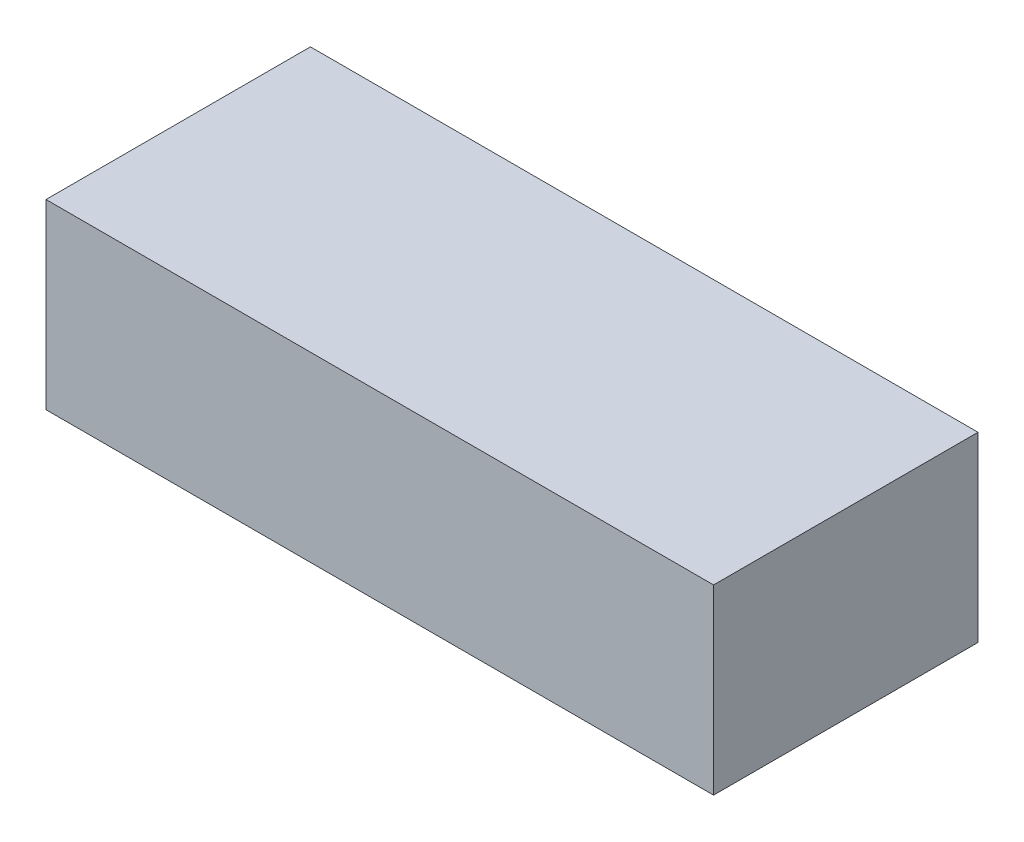
ISO-10303-21;
HEADER;
FILE_DESCRIPTION(('STEP AP214'),'2;1');
FILE_NAME('part.step','',(''),(''),'','','');
FILE_SCHEMA(('AUTOMOTIVE_DESIGN { 1 0 10303 214 1 1 1 1 }'));
ENDSEC;
DATA;
#1=APPLICATION_CONTEXT('core data for automotive mechanical design processes');
#2=APPLICATION_PROTOCOL_DEFINITION('international standard','automotive_design',2000,#1);
#3=PRODUCT_CONTEXT('',#1,'mechanical');
#4=PRODUCT('Part','Part','',(#3));
#5=PRODUCT_RELATED_PRODUCT_CATEGORY('part','',(#4));
#6=PRODUCT_DEFINITION_FORMATION('','',#4);
#7=PRODUCT_DEFINITION_CONTEXT('part definition',#1,'design');
#8=PRODUCT_DEFINITION('design','',#6,#7);
#9=PRODUCT_DEFINITION_SHAPE('','',#8);
#10=(LENGTH_UNIT() NAMED_UNIT(*) SI_UNIT(.MILLI.,.METRE.));
#11=(NAMED_UNIT(*) PLANE_ANGLE_UNIT() SI_UNIT($,.RADIAN.));
#12=(NAMED_UNIT(*) SI_UNIT($,.STERADIAN.) SOLID_ANGLE_UNIT());
#13=UNCERTAINTY_MEASURE_WITH_UNIT(LENGTH_MEASURE(1.E-05),#10,'distance_accuracy_value','');
#14=(GEOMETRIC_REPRESENTATION_CONTEXT(3) GLOBAL_UNCERTAINTY_ASSIGNED_CONTEXT((#13)) GLOBAL_UNIT_ASSIGNED_CONTEXT((#10,
#11,#12)) REPRESENTATION_CONTEXT('',''));
#15=CARTESIAN_POINT('',(0.,0.,0.));
#16=DIRECTION('',(0.,0.,1.));
#17=DIRECTION('',(1.,0.,0.));
#18=AXIS2_PLACEMENT_3D('',#15,#16,#17);
#19=CARTESIAN_POINT('',(38.5,21.,-15.25));
#20=DIRECTION('',(-1.,0.,0.));
#21=DIRECTION('',(0.,0.,1.));
#22=AXIS2_PLACEMENT_3D('',#19,#20,#21);
#23=PLANE('',#22);
#24=DIRECTION('',(0.,0.,-1.));
#25=VECTOR('',#24,1.);
#26=CARTESIAN_POINT('',(38.5,0.,-15.25));
#27=LINE('',#26,#25);
#28=CARTESIAN_POINT('',(38.5,0.,15.25));
#29=VERTEX_POINT('',#28);
#30=CARTESIAN_POINT('',(38.5,0.,-15.25));
#31=VERTEX_POINT('',#30);
#32=EDGE_CURVE('E102',#29,#31,#27,.T.);
#33=ORIENTED_EDGE('',*,*,#32,.T.);
#34=DIRECTION('',(0.,-1.,0.));
#35=VECTOR('',#34,1.);
#36=CARTESIAN_POINT('',(38.5,21.,-15.25));
#37=LINE('',#36,#35);
#38=CARTESIAN_POINT('',(38.5,21.,-15.25));
#39=VERTEX_POINT('',#38);
#40=EDGE_CURVE('E11',#39,#31,#37,.T.);
#41=ORIENTED_EDGE('',*,*,#40,.F.);
#42=DIRECTION('',(0.,0.,-1.));
#43=VECTOR('',#42,1.);
#44=CARTESIAN_POINT('',(38.5,21.,-15.25));
#45=LINE('',#44,#43);
#46=CARTESIAN_POINT('',(38.5,21.,15.25));
#47=VERTEX_POINT('',#46);
#48=EDGE_CURVE('E90',#47,#39,#45,.T.);
#49=ORIENTED_EDGE('',*,*,#48,.F.);
#50=DIRECTION('',(0.,-1.,0.));
#51=VECTOR('',#50,1.);
#52=CARTESIAN_POINT('',(38.5,21.,15.25));
#53=LINE('',#52,#51);
#54=EDGE_CURVE('E98',#47,#29,#53,.T.);
#55=ORIENTED_EDGE('',*,*,#54,.T.);
#56=EDGE_LOOP('',(#33,#41,#49,#55));
#57=FACE_BOUND('',#56,.T.);
#58=ADVANCED_FACE('F39',(#57),#23,.F.);
#59=CARTESIAN_POINT('',(-38.5,21.,-15.25));
#60=DIRECTION('',(0.,0.,1.));
#61=DIRECTION('',(1.,0.,0.));
#62=AXIS2_PLACEMENT_3D('',#59,#60,#61);
#63=PLANE('',#62);
#64=DIRECTION('',(-1.,0.,0.));
#65=VECTOR('',#64,1.);
#66=CARTESIAN_POINT('',(-38.5,0.,-15.25));
#67=LINE('',#66,#65);
#68=CARTESIAN_POINT('',(-38.5,0.,-15.25));
#69=VERTEX_POINT('',#68);
#70=EDGE_CURVE('E94',#31,#69,#67,.T.);
#71=ORIENTED_EDGE('',*,*,#70,.T.);
#72=DIRECTION('',(0.,-1.,0.));
#73=VECTOR('',#72,1.);
#74=CARTESIAN_POINT('',(-38.5,21.,-15.25));
#75=LINE('',#74,#73);
#76=CARTESIAN_POINT('',(-38.5,21.,-15.25));
#77=VERTEX_POINT('',#76);
#78=EDGE_CURVE('E47',#77,#69,#75,.T.);
#79=ORIENTED_EDGE('',*,*,#78,.F.);
#80=DIRECTION('',(-1.,0.,0.));
#81=VECTOR('',#80,1.);
#82=CARTESIAN_POINT('',(-38.5,21.,-15.25));
#83=LINE('',#82,#81);
#84=EDGE_CURVE('E85',#39,#77,#83,.T.);
#85=ORIENTED_EDGE('',*,*,#84,.F.);
#86=ORIENTED_EDGE('',*,*,#40,.T.);
#87=EDGE_LOOP('',(#71,#79,#85,#86));
#88=FACE_BOUND('',#87,.T.);
#89=ADVANCED_FACE('F93',(#88),#63,.F.);
#90=CARTESIAN_POINT('',(-38.5,21.,-15.25));
#91=DIRECTION('',(1.,0.,0.));
#92=DIRECTION('',(0.,0.,-1.));
#93=AXIS2_PLACEMENT_3D('',#90,#91,#92);
#94=PLANE('',#93);
#95=DIRECTION('',(0.,0.,1.));
#96=VECTOR('',#95,1.);
#97=CARTESIAN_POINT('',(-38.5,0.,-15.25));
#98=LINE('',#97,#96);
#99=CARTESIAN_POINT('',(-38.5,0.,15.25));
#100=VERTEX_POINT('',#99);
#101=EDGE_CURVE('E72',#69,#100,#98,.T.);
#102=ORIENTED_EDGE('',*,*,#101,.T.);
#103=DIRECTION('',(0.,-1.,0.));
#104=VECTOR('',#103,1.);
#105=CARTESIAN_POINT('',(-38.5,21.,15.25));
#106=LINE('',#105,#104);
#107=CARTESIAN_POINT('',(-38.5,21.,15.25));
#108=VERTEX_POINT('',#107);
#109=EDGE_CURVE('E95',#108,#100,#106,.T.);
#110=ORIENTED_EDGE('',*,*,#109,.F.);
#111=DIRECTION('',(0.,0.,1.));
#112=VECTOR('',#111,1.);
#113=CARTESIAN_POINT('',(-38.5,21.,-15.25));
#114=LINE('',#113,#112);
#115=EDGE_CURVE('E88',#77,#108,#114,.T.);
#116=ORIENTED_EDGE('',*,*,#115,.F.);
#117=ORIENTED_EDGE('',*,*,#78,.T.);
#118=EDGE_LOOP('',(#102,#110,#116,#117));
#119=FACE_BOUND('',#118,.T.);
#120=ADVANCED_FACE('F96',(#119),#94,.F.);
#121=CARTESIAN_POINT('',(-38.5,21.,15.25));
#122=DIRECTION('',(0.,0.,-1.));
#123=DIRECTION('',(-1.,0.,0.));
#124=AXIS2_PLACEMENT_3D('',#121,#122,#123);
#125=PLANE('',#124);
#126=DIRECTION('',(1.,0.,0.));
#127=VECTOR('',#126,1.);
#128=CARTESIAN_POINT('',(-38.5,0.,15.25));
#129=LINE('',#128,#127);
#130=EDGE_CURVE('E78',#100,#29,#129,.T.);
#131=ORIENTED_EDGE('',*,*,#130,.T.);
#132=ORIENTED_EDGE('',*,*,#54,.F.);
#133=DIRECTION('',(1.,0.,0.));
#134=VECTOR('',#133,1.);
#135=CARTESIAN_POINT('',(-38.5,21.,15.25));
#136=LINE('',#135,#134);
#137=EDGE_CURVE('E55',#108,#47,#136,.T.);
#138=ORIENTED_EDGE('',*,*,#137,.F.);
#139=ORIENTED_EDGE('',*,*,#109,.T.);
#140=EDGE_LOOP('',(#131,#132,#138,#139));
#141=FACE_BOUND('',#140,.T.);
#142=ADVANCED_FACE('F109',(#141),#125,.F.);
#143=CARTESIAN_POINT('',(0.,21.,0.));
#144=DIRECTION('',(0.,1.,0.));
#145=DIRECTION('',(0.,0.,1.));
#146=AXIS2_PLACEMENT_3D('',#143,#144,#145);
#147=PLANE('',#146);
#148=ORIENTED_EDGE('',*,*,#48,.T.);
#149=ORIENTED_EDGE('',*,*,#84,.T.);
#150=ORIENTED_EDGE('',*,*,#115,.T.);
#151=ORIENTED_EDGE('',*,*,#137,.T.);
#152=EDGE_LOOP('',(#148,#149,#150,#151));
#153=FACE_BOUND('',#152,.T.);
#154=ADVANCED_FACE('F86',(#153),#147,.T.);
#155=CARTESIAN_POINT('',(0.,0.,0.));
#156=DIRECTION('',(0.,1.,0.));
#157=DIRECTION('',(0.,0.,1.));
#158=AXIS2_PLACEMENT_3D('',#155,#156,#157);
#159=PLANE('',#158);
#160=ORIENTED_EDGE('',*,*,#32,.F.);
#161=ORIENTED_EDGE('',*,*,#130,.F.);
#162=ORIENTED_EDGE('',*,*,#101,.F.);
#163=ORIENTED_EDGE('',*,*,#70,.F.);
#164=EDGE_LOOP('',(#160,#161,#162,#163));
#165=FACE_BOUND('',#164,.T.);
#166=ADVANCED_FACE('F112',(#165),#159,.F.);
#167=CLOSED_SHELL('',(#58,#89,#120,#142,#154,#166));
#168=MANIFOLD_SOLID_BREP('B2',#167);
#169=ADVANCED_BREP_SHAPE_REPRESENTATION('',(#18,#168),#14);
#170=SHAPE_DEFINITION_REPRESENTATION(#9,#169);
ENDSEC;
END-ISO-10303-21;
